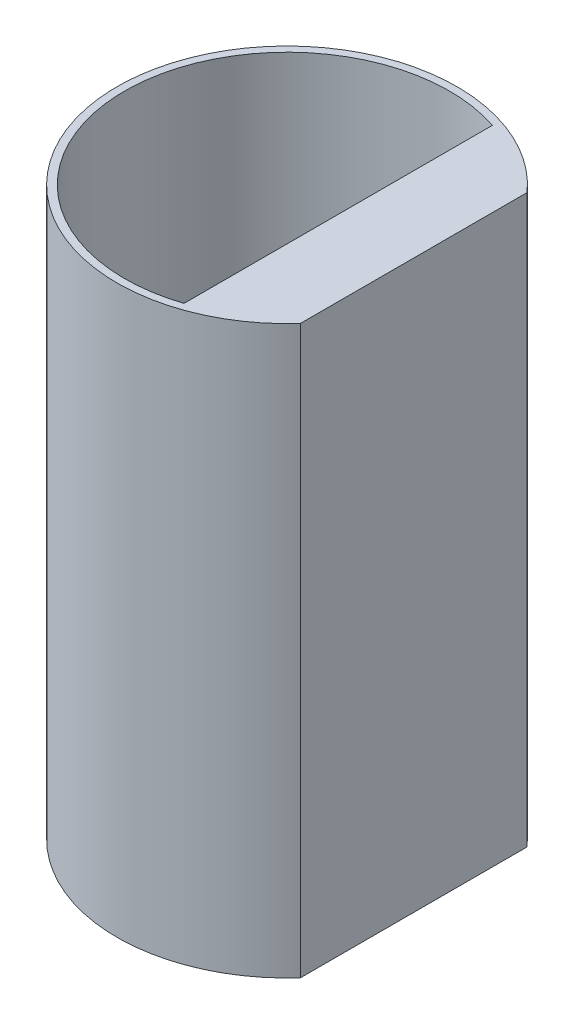
ISO-10303-21;
HEADER;
FILE_DESCRIPTION(('STEP AP214'),'2;1');
FILE_NAME('part.step','',(''),(''),'','','');
FILE_SCHEMA(('AUTOMOTIVE_DESIGN { 1 0 10303 214 1 1 1 1 }'));
ENDSEC;
DATA;
#1=APPLICATION_CONTEXT('core data for automotive mechanical design processes');
#2=APPLICATION_PROTOCOL_DEFINITION('international standard','automotive_design',2000,#1);
#3=PRODUCT_CONTEXT('',#1,'mechanical');
#4=PRODUCT('Part','Part','',(#3));
#5=PRODUCT_RELATED_PRODUCT_CATEGORY('part','',(#4));
#6=PRODUCT_DEFINITION_FORMATION('','',#4);
#7=PRODUCT_DEFINITION_CONTEXT('part definition',#1,'design');
#8=PRODUCT_DEFINITION('design','',#6,#7);
#9=PRODUCT_DEFINITION_SHAPE('','',#8);
#10=(LENGTH_UNIT() NAMED_UNIT(*) SI_UNIT(.MILLI.,.METRE.));
#11=(NAMED_UNIT(*) PLANE_ANGLE_UNIT() SI_UNIT($,.RADIAN.));
#12=(NAMED_UNIT(*) SI_UNIT($,.STERADIAN.) SOLID_ANGLE_UNIT());
#13=UNCERTAINTY_MEASURE_WITH_UNIT(LENGTH_MEASURE(1.E-05),#10,'distance_accuracy_value','');
#14=(GEOMETRIC_REPRESENTATION_CONTEXT(3) GLOBAL_UNCERTAINTY_ASSIGNED_CONTEXT((#13)) GLOBAL_UNIT_ASSIGNED_CONTEXT((#10,
#11,#12)) REPRESENTATION_CONTEXT('',''));
#15=CARTESIAN_POINT('',(0.,0.,0.));
#16=DIRECTION('',(0.,0.,1.));
#17=DIRECTION('',(1.,0.,0.));
#18=AXIS2_PLACEMENT_3D('',#15,#16,#17);
#19=CARTESIAN_POINT('',(0.,190.5,0.));
#20=DIRECTION('',(0.,-1.,0.));
#21=DIRECTION('',(0.,0.,-1.));
#22=AXIS2_PLACEMENT_3D('',#19,#20,#21);
#23=CYLINDRICAL_SURFACE('',#22,57.15);
#24=DIRECTION('',(0.,1.,0.));
#25=VECTOR('',#24,1.);
#26=CARTESIAN_POINT('',(42.597094971371,0.,38.1));
#27=LINE('',#26,#25);
#28=CARTESIAN_POINT('',(42.597094971371,0.,38.1));
#29=VERTEX_POINT('',#28);
#30=CARTESIAN_POINT('',(42.597094971371,190.5,38.1));
#31=VERTEX_POINT('',#30);
#32=EDGE_CURVE('E55',#29,#31,#27,.T.);
#33=ORIENTED_EDGE('',*,*,#32,.T.);
#34=CARTESIAN_POINT('',(0.,190.5,0.));
#35=DIRECTION('',(0.,1.,0.));
#36=DIRECTION('',(0.,0.,1.));
#37=AXIS2_PLACEMENT_3D('',#34,#35,#36);
#38=CIRCLE('',#37,57.15);
#39=CARTESIAN_POINT('',(42.597094971371,190.5,-38.1));
#40=VERTEX_POINT('',#39);
#41=EDGE_CURVE('E11',#40,#31,#38,.T.);
#42=ORIENTED_EDGE('',*,*,#41,.F.);
#43=DIRECTION('',(0.,1.,0.));
#44=VECTOR('',#43,1.);
#45=CARTESIAN_POINT('',(42.597094971371,0.,-38.1));
#46=LINE('',#45,#44);
#47=CARTESIAN_POINT('',(42.597094971371,0.,-38.1));
#48=VERTEX_POINT('',#47);
#49=EDGE_CURVE('E98',#48,#40,#46,.T.);
#50=ORIENTED_EDGE('',*,*,#49,.F.);
#51=CARTESIAN_POINT('',(0.,0.,0.));
#52=DIRECTION('',(0.,1.,0.));
#53=DIRECTION('',(0.,0.,1.));
#54=AXIS2_PLACEMENT_3D('',#51,#52,#53);
#55=CIRCLE('',#54,57.15);
#56=EDGE_CURVE('E36',#48,#29,#55,.T.);
#57=ORIENTED_EDGE('',*,*,#56,.T.);
#58=EDGE_LOOP('',(#33,#42,#50,#57));
#59=FACE_BOUND('',#58,.T.);
#60=ADVANCED_FACE('F33',(#59),#23,.T.);
#61=CARTESIAN_POINT('',(0.,190.5,0.));
#62=DIRECTION('',(0.,1.,0.));
#63=DIRECTION('',(0.,0.,1.));
#64=AXIS2_PLACEMENT_3D('',#61,#62,#63);
#65=PLANE('',#64);
#66=CARTESIAN_POINT('',(0.,190.5,0.));
#67=DIRECTION('',(0.,1.,0.));
#68=DIRECTION('',(0.,0.,1.));
#69=AXIS2_PLACEMENT_3D('',#66,#67,#68);
#70=CIRCLE('',#69,54.61);
#71=CARTESIAN_POINT('',(17.197094971371,190.5,-51.8315736259825));
#72=VERTEX_POINT('',#71);
#73=CARTESIAN_POINT('',(17.197094971371,190.5,51.8315736259825));
#74=VERTEX_POINT('',#73);
#75=EDGE_CURVE('E47',#72,#74,#70,.T.);
#76=ORIENTED_EDGE('',*,*,#75,.F.);
#77=DIRECTION('',(0.,0.,-1.));
#78=VECTOR('',#77,1.);
#79=CARTESIAN_POINT('',(17.197094971371,190.5,0.));
#80=LINE('',#79,#78);
#81=EDGE_CURVE('E85',#74,#72,#80,.T.);
#82=ORIENTED_EDGE('',*,*,#81,.F.);
#83=EDGE_LOOP('',(#76,#82));
#84=FACE_BOUND('',#83,.T.);
#85=ORIENTED_EDGE('',*,*,#41,.T.);
#86=DIRECTION('',(0.,0.,-1.));
#87=VECTOR('',#86,1.);
#88=CARTESIAN_POINT('',(42.597094971371,190.5,0.));
#89=LINE('',#88,#87);
#90=EDGE_CURVE('E89',#31,#40,#89,.T.);
#91=ORIENTED_EDGE('',*,*,#90,.T.);
#92=EDGE_LOOP('',(#85,#91));
#93=FACE_BOUND('',#92,.T.);
#94=ADVANCED_FACE('F106',(#84,#93),#65,.T.);
#95=CARTESIAN_POINT('',(0.,0.,0.));
#96=DIRECTION('',(0.,1.,0.));
#97=DIRECTION('',(0.,0.,1.));
#98=AXIS2_PLACEMENT_3D('',#95,#96,#97);
#99=PLANE('',#98);
#100=DIRECTION('',(0.,0.,-1.));
#101=VECTOR('',#100,1.);
#102=CARTESIAN_POINT('',(42.597094971371,0.,0.));
#103=LINE('',#102,#101);
#104=EDGE_CURVE('E94',#29,#48,#103,.T.);
#105=ORIENTED_EDGE('',*,*,#104,.F.);
#106=ORIENTED_EDGE('',*,*,#56,.F.);
#107=EDGE_LOOP('',(#105,#106));
#108=FACE_BOUND('',#107,.T.);
#109=ADVANCED_FACE('F109',(#108),#99,.F.);
#110=CARTESIAN_POINT('',(42.597094971371,0.,0.));
#111=DIRECTION('',(1.,0.,0.));
#112=DIRECTION('',(0.,0.,-1.));
#113=AXIS2_PLACEMENT_3D('',#110,#111,#112);
#114=PLANE('',#113);
#115=ORIENTED_EDGE('',*,*,#90,.F.);
#116=ORIENTED_EDGE('',*,*,#32,.F.);
#117=ORIENTED_EDGE('',*,*,#104,.T.);
#118=ORIENTED_EDGE('',*,*,#49,.T.);
#119=EDGE_LOOP('',(#115,#116,#117,#118));
#120=FACE_BOUND('',#119,.T.);
#121=ADVANCED_FACE('F107',(#120),#114,.T.);
#122=CARTESIAN_POINT('',(0.,190.5,0.));
#123=DIRECTION('',(0.,-1.,0.));
#124=DIRECTION('',(0.,0.,-1.));
#125=AXIS2_PLACEMENT_3D('',#122,#123,#124);
#126=CYLINDRICAL_SURFACE('',#125,54.61);
#127=DIRECTION('',(0.,-1.,0.));
#128=VECTOR('',#127,1.);
#129=CARTESIAN_POINT('',(17.197094971371,12.7,51.8315736259825));
#130=LINE('',#129,#128);
#131=CARTESIAN_POINT('',(17.197094971371,12.7,51.8315736259825));
#132=VERTEX_POINT('',#131);
#133=EDGE_CURVE('E71',#132,#74,#130,.F.);
#134=ORIENTED_EDGE('',*,*,#133,.F.);
#135=CARTESIAN_POINT('',(0.,12.7,0.));
#136=DIRECTION('',(0.,1.,0.));
#137=DIRECTION('',(0.,0.,1.));
#138=AXIS2_PLACEMENT_3D('',#135,#136,#137);
#139=CIRCLE('',#138,54.61);
#140=CARTESIAN_POINT('',(17.197094971371,12.7,-51.8315736259825));
#141=VERTEX_POINT('',#140);
#142=EDGE_CURVE('E75',#141,#132,#139,.T.);
#143=ORIENTED_EDGE('',*,*,#142,.F.);
#144=DIRECTION('',(0.,-1.,0.));
#145=VECTOR('',#144,1.);
#146=CARTESIAN_POINT('',(17.197094971371,12.7,-51.8315736259825));
#147=LINE('',#146,#145);
#148=EDGE_CURVE('E79',#141,#72,#147,.F.);
#149=ORIENTED_EDGE('',*,*,#148,.T.);
#150=ORIENTED_EDGE('',*,*,#75,.T.);
#151=EDGE_LOOP('',(#134,#143,#149,#150));
#152=FACE_BOUND('',#151,.T.);
#153=ADVANCED_FACE('F73',(#152),#126,.F.);
#154=CARTESIAN_POINT('',(0.,12.7,0.));
#155=DIRECTION('',(0.,1.,0.));
#156=DIRECTION('',(0.,0.,1.));
#157=AXIS2_PLACEMENT_3D('',#154,#155,#156);
#158=PLANE('',#157);
#159=DIRECTION('',(0.,0.,-1.));
#160=VECTOR('',#159,1.);
#161=CARTESIAN_POINT('',(17.197094971371,12.7,0.));
#162=LINE('',#161,#160);
#163=EDGE_CURVE('E80',#132,#141,#162,.T.);
#164=ORIENTED_EDGE('',*,*,#163,.T.);
#165=ORIENTED_EDGE('',*,*,#142,.T.);
#166=EDGE_LOOP('',(#164,#165));
#167=FACE_BOUND('',#166,.T.);
#168=ADVANCED_FACE('F87',(#167),#158,.T.);
#169=CARTESIAN_POINT('',(17.197094971371,0.,0.));
#170=DIRECTION('',(1.,0.,0.));
#171=DIRECTION('',(0.,0.,-1.));
#172=AXIS2_PLACEMENT_3D('',#169,#170,#171);
#173=PLANE('',#172);
#174=ORIENTED_EDGE('',*,*,#81,.T.);
#175=ORIENTED_EDGE('',*,*,#148,.F.);
#176=ORIENTED_EDGE('',*,*,#163,.F.);
#177=ORIENTED_EDGE('',*,*,#133,.T.);
#178=EDGE_LOOP('',(#174,#175,#176,#177));
#179=FACE_BOUND('',#178,.T.);
#180=ADVANCED_FACE('F83',(#179),#173,.F.);
#181=CLOSED_SHELL('',(#60,#94,#109,#121,#153,#168,#180));
#182=MANIFOLD_SOLID_BREP('B2',#181);
#183=ADVANCED_BREP_SHAPE_REPRESENTATION('',(#18,#182),#14);
#184=SHAPE_DEFINITION_REPRESENTATION(#9,#183);
ENDSEC;
END-ISO-10303-21;
